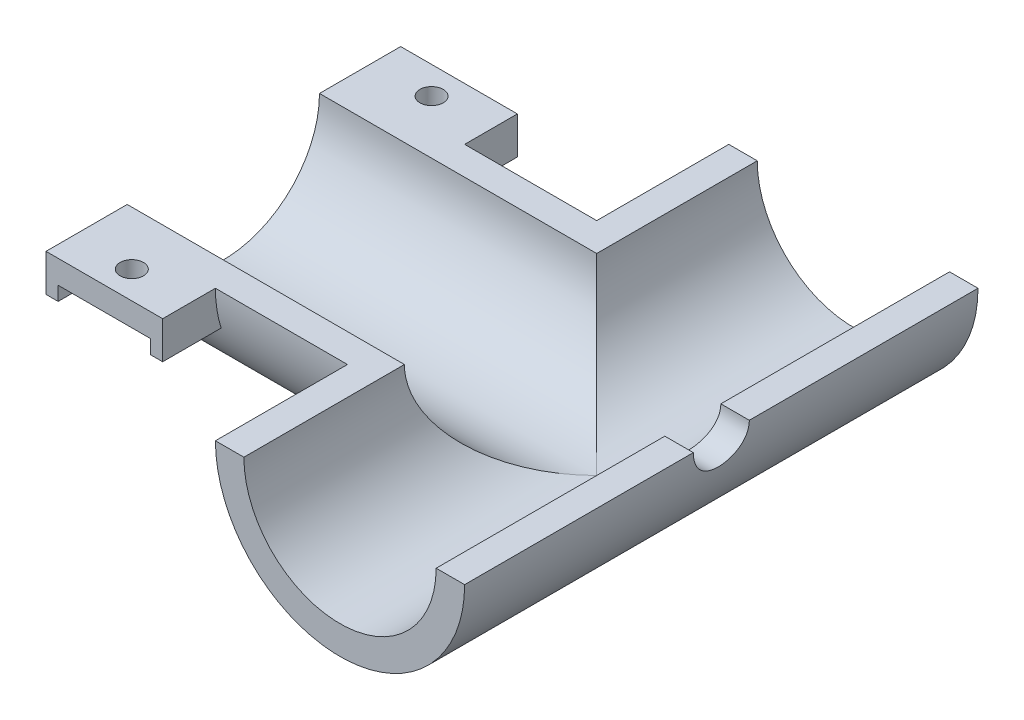
ISO-10303-21;
HEADER;
FILE_DESCRIPTION(('STEP AP214'),'2;1');
FILE_NAME('part.step','',(''),(''),'','','');
FILE_SCHEMA(('AUTOMOTIVE_DESIGN { 1 0 10303 214 1 1 1 1 }'));
ENDSEC;
DATA;
#1=APPLICATION_CONTEXT('core data for automotive mechanical design processes');
#2=APPLICATION_PROTOCOL_DEFINITION('international standard','automotive_design',2000,#1);
#3=PRODUCT_CONTEXT('',#1,'mechanical');
#4=PRODUCT('Part','Part','',(#3));
#5=PRODUCT_RELATED_PRODUCT_CATEGORY('part','',(#4));
#6=PRODUCT_DEFINITION_FORMATION('','',#4);
#7=PRODUCT_DEFINITION_CONTEXT('part definition',#1,'design');
#8=PRODUCT_DEFINITION('design','',#6,#7);
#9=PRODUCT_DEFINITION_SHAPE('','',#8);
#10=(LENGTH_UNIT() NAMED_UNIT(*) SI_UNIT(.MILLI.,.METRE.));
#11=(NAMED_UNIT(*) PLANE_ANGLE_UNIT() SI_UNIT($,.RADIAN.));
#12=(NAMED_UNIT(*) SI_UNIT($,.STERADIAN.) SOLID_ANGLE_UNIT());
#13=UNCERTAINTY_MEASURE_WITH_UNIT(LENGTH_MEASURE(1.E-05),#10,'distance_accuracy_value','');
#14=(GEOMETRIC_REPRESENTATION_CONTEXT(3) GLOBAL_UNCERTAINTY_ASSIGNED_CONTEXT((#13)) GLOBAL_UNIT_ASSIGNED_CONTEXT((#10,
#11,#12)) REPRESENTATION_CONTEXT('',''));
#15=CARTESIAN_POINT('',(0.,0.,0.));
#16=DIRECTION('',(0.,0.,1.));
#17=DIRECTION('',(1.,0.,0.));
#18=AXIS2_PLACEMENT_3D('',#15,#16,#17);
#19=CARTESIAN_POINT('',(1.651,-5.08,34.926));
#20=DIRECTION('',(-1.,0.,0.));
#21=DIRECTION('',(0.,0.,-1.));
#22=AXIS2_PLACEMENT_3D('',#19,#20,#21);
#23=PLANE('',#22);
#24=DIRECTION('',(0.,0.,-1.));
#25=VECTOR('',#24,1.);
#26=CARTESIAN_POINT('',(1.651,-3.175,34.926));
#27=LINE('',#26,#25);
#28=CARTESIAN_POINT('',(1.651,-3.175,-16.6545622953592));
#29=VERTEX_POINT('',#28);
#30=CARTESIAN_POINT('',(1.651,-3.175,-24.13));
#31=VERTEX_POINT('',#30);
#32=EDGE_CURVE('E140',#29,#31,#27,.T.);
#33=ORIENTED_EDGE('',*,*,#32,.F.);
#34=CARTESIAN_POINT('',(1.651,0.,0.));
#35=DIRECTION('',(-1.,0.,0.));
#36=DIRECTION('',(0.,0.,1.));
#37=AXIS2_PLACEMENT_3D('',#34,#35,#36);
#38=CIRCLE('',#37,16.9545);
#39=CARTESIAN_POINT('',(1.651,-5.08,-16.1755578033649));
#40=VERTEX_POINT('',#39);
#41=EDGE_CURVE('E121',#29,#40,#38,.T.);
#42=ORIENTED_EDGE('',*,*,#41,.T.);
#43=DIRECTION('',(0.,0.,-1.));
#44=VECTOR('',#43,1.);
#45=CARTESIAN_POINT('',(1.651,-5.08,34.926));
#46=LINE('',#45,#44);
#47=CARTESIAN_POINT('',(1.651,-5.08,-24.13));
#48=VERTEX_POINT('',#47);
#49=EDGE_CURVE('E143',#40,#48,#46,.T.);
#50=ORIENTED_EDGE('',*,*,#49,.T.);
#51=DIRECTION('',(0.,-1.,0.));
#52=VECTOR('',#51,1.);
#53=CARTESIAN_POINT('',(1.651,-5.08,-24.13));
#54=LINE('',#53,#52);
#55=EDGE_CURVE('E137',#31,#48,#54,.T.);
#56=ORIENTED_EDGE('',*,*,#55,.F.);
#57=EDGE_LOOP('',(#33,#42,#50,#56));
#58=FACE_BOUND('',#57,.T.);
#59=ADVANCED_FACE('F34',(#58),#23,.F.);
#60=CARTESIAN_POINT('',(0.,-5.08,34.926));
#61=DIRECTION('',(0.,-1.,0.));
#62=DIRECTION('',(0.,0.,1.));
#63=AXIS2_PLACEMENT_3D('',#60,#61,#62);
#64=PLANE('',#63);
#65=ORIENTED_EDGE('',*,*,#49,.F.);
#66=DIRECTION('',(-1.,0.,0.));
#67=VECTOR('',#66,1.);
#68=CARTESIAN_POINT('',(50.8,-5.08,-16.1755578033649));
#69=LINE('',#68,#67);
#70=CARTESIAN_POINT('',(0.,-5.08,-16.1755578033649));
#71=VERTEX_POINT('',#70);
#72=EDGE_CURVE('E12',#71,#40,#69,.F.);
#73=ORIENTED_EDGE('',*,*,#72,.F.);
#74=DIRECTION('',(0.,0.,-1.));
#75=VECTOR('',#74,1.);
#76=CARTESIAN_POINT('',(0.,-5.08,34.926));
#77=LINE('',#76,#75);
#78=CARTESIAN_POINT('',(0.,-5.08,-24.13));
#79=VERTEX_POINT('',#78);
#80=EDGE_CURVE('E113',#71,#79,#77,.T.);
#81=ORIENTED_EDGE('',*,*,#80,.T.);
#82=DIRECTION('',(1.,0.,0.));
#83=VECTOR('',#82,1.);
#84=CARTESIAN_POINT('',(0.,-5.08,-24.13));
#85=LINE('',#84,#83);
#86=EDGE_CURVE('E93',#79,#48,#85,.T.);
#87=ORIENTED_EDGE('',*,*,#86,.T.);
#88=EDGE_LOOP('',(#65,#73,#81,#87));
#89=FACE_BOUND('',#88,.T.);
#90=ADVANCED_FACE('F485',(#89),#64,.T.);
#91=CARTESIAN_POINT('',(0.,0.,34.926));
#92=DIRECTION('',(-1.,0.,0.));
#93=DIRECTION('',(0.,-1.,0.));
#94=AXIS2_PLACEMENT_3D('',#91,#92,#93);
#95=PLANE('',#94);
#96=DIRECTION('',(0.,0.,-1.));
#97=VECTOR('',#96,1.);
#98=CARTESIAN_POINT('',(0.,0.,34.926));
#99=LINE('',#98,#97);
#100=CARTESIAN_POINT('',(0.,0.,-13.081));
#101=VERTEX_POINT('',#100);
#102=CARTESIAN_POINT('',(0.,0.,-24.13));
#103=VERTEX_POINT('',#102);
#104=EDGE_CURVE('E110',#101,#103,#99,.T.);
#105=ORIENTED_EDGE('',*,*,#104,.T.);
#106=DIRECTION('',(0.,-1.,0.));
#107=VECTOR('',#106,1.);
#108=CARTESIAN_POINT('',(0.,0.,-24.13));
#109=LINE('',#108,#107);
#110=EDGE_CURVE('E99',#103,#79,#109,.T.);
#111=ORIENTED_EDGE('',*,*,#110,.T.);
#112=ORIENTED_EDGE('',*,*,#80,.F.);
#113=CARTESIAN_POINT('',(0.,0.,0.));
#114=DIRECTION('',(1.,0.,0.));
#115=DIRECTION('',(0.,0.,-1.));
#116=AXIS2_PLACEMENT_3D('',#113,#114,#115);
#117=CIRCLE('',#116,16.9545);
#118=CARTESIAN_POINT('',(0.,-5.08,16.1755578033649));
#119=VERTEX_POINT('',#118);
#120=EDGE_CURVE('E419',#119,#71,#117,.T.);
#121=ORIENTED_EDGE('',*,*,#120,.F.);
#122=DIRECTION('',(0.,0.,1.));
#123=VECTOR('',#122,1.);
#124=CARTESIAN_POINT('',(0.,-5.08,-34.926));
#125=LINE('',#124,#123);
#126=CARTESIAN_POINT('',(0.,-5.08,24.13));
#127=VERTEX_POINT('',#126);
#128=EDGE_CURVE('E343',#119,#127,#125,.T.);
#129=ORIENTED_EDGE('',*,*,#128,.T.);
#130=DIRECTION('',(0.,-1.,0.));
#131=VECTOR('',#130,1.);
#132=CARTESIAN_POINT('',(0.,0.,24.13));
#133=LINE('',#132,#131);
#134=CARTESIAN_POINT('',(0.,0.,24.13));
#135=VERTEX_POINT('',#134);
#136=EDGE_CURVE('E351',#135,#127,#133,.T.);
#137=ORIENTED_EDGE('',*,*,#136,.F.);
#138=DIRECTION('',(0.,0.,1.));
#139=VECTOR('',#138,1.);
#140=CARTESIAN_POINT('',(0.,0.,-34.926));
#141=LINE('',#140,#139);
#142=CARTESIAN_POINT('',(0.,0.,13.081));
#143=VERTEX_POINT('',#142);
#144=EDGE_CURVE('E346',#143,#135,#141,.T.);
#145=ORIENTED_EDGE('',*,*,#144,.F.);
#146=CARTESIAN_POINT('',(0.,0.,0.));
#147=DIRECTION('',(-1.,0.,0.));
#148=DIRECTION('',(0.,0.,1.));
#149=AXIS2_PLACEMENT_3D('',#146,#147,#148);
#150=CIRCLE('',#149,13.081);
#151=EDGE_CURVE('E725',#101,#143,#150,.T.);
#152=ORIENTED_EDGE('',*,*,#151,.F.);
#153=EDGE_LOOP('',(#105,#111,#112,#121,#129,#137,#145,#152));
#154=FACE_BOUND('',#153,.T.);
#155=ADVANCED_FACE('F415',(#154),#95,.T.);
#156=CARTESIAN_POINT('',(0.,0.,-24.13));
#157=DIRECTION('',(0.,0.,-1.));
#158=DIRECTION('',(1.,0.,0.));
#159=AXIS2_PLACEMENT_3D('',#156,#157,#158);
#160=PLANE('',#159);
#161=ORIENTED_EDGE('',*,*,#55,.T.);
#162=ORIENTED_EDGE('',*,*,#86,.F.);
#163=ORIENTED_EDGE('',*,*,#110,.F.);
#164=DIRECTION('',(-1.,0.,0.));
#165=VECTOR('',#164,1.);
#166=CARTESIAN_POINT('',(0.,0.,-24.13));
#167=LINE('',#166,#165);
#168=CARTESIAN_POINT('',(15.875,0.,-24.13));
#169=VERTEX_POINT('',#168);
#170=EDGE_CURVE('E92',#169,#103,#167,.T.);
#171=ORIENTED_EDGE('',*,*,#170,.F.);
#172=DIRECTION('',(0.,1.,0.));
#173=VECTOR('',#172,1.);
#174=CARTESIAN_POINT('',(15.875,0.,-24.13));
#175=LINE('',#174,#173);
#176=CARTESIAN_POINT('',(15.875,-5.08,-24.13));
#177=VERTEX_POINT('',#176);
#178=EDGE_CURVE('E81',#177,#169,#175,.T.);
#179=ORIENTED_EDGE('',*,*,#178,.F.);
#180=CARTESIAN_POINT('',(14.224,-5.08,-24.13));
#181=VERTEX_POINT('',#180);
#182=EDGE_CURVE('E150',#181,#177,#85,.T.);
#183=ORIENTED_EDGE('',*,*,#182,.F.);
#184=DIRECTION('',(0.,1.,0.));
#185=VECTOR('',#184,1.);
#186=CARTESIAN_POINT('',(14.224,-5.08,-24.13));
#187=LINE('',#186,#185);
#188=CARTESIAN_POINT('',(14.224,-3.175,-24.13));
#189=VERTEX_POINT('',#188);
#190=EDGE_CURVE('E134',#181,#189,#187,.T.);
#191=ORIENTED_EDGE('',*,*,#190,.T.);
#192=DIRECTION('',(-1.,0.,0.));
#193=VECTOR('',#192,1.);
#194=CARTESIAN_POINT('',(1.651,-3.175,-24.13));
#195=LINE('',#194,#193);
#196=EDGE_CURVE('E118',#189,#31,#195,.T.);
#197=ORIENTED_EDGE('',*,*,#196,.T.);
#198=EDGE_LOOP('',(#161,#162,#163,#171,#179,#183,#191,#197));
#199=FACE_BOUND('',#198,.T.);
#200=ADVANCED_FACE('F96',(#199),#160,.T.);
#201=CARTESIAN_POINT('',(15.875,0.,34.926));
#202=DIRECTION('',(1.,0.,0.));
#203=DIRECTION('',(0.,0.,1.));
#204=AXIS2_PLACEMENT_3D('',#201,#202,#203);
#205=PLANE('',#204);
#206=DIRECTION('',(0.,0.,-1.));
#207=VECTOR('',#206,1.);
#208=CARTESIAN_POINT('',(15.875,-5.08,34.926));
#209=LINE('',#208,#207);
#210=CARTESIAN_POINT('',(15.875,-5.08,-16.1755578033649));
#211=VERTEX_POINT('',#210);
#212=EDGE_CURVE('E89',#211,#177,#209,.T.);
#213=ORIENTED_EDGE('',*,*,#212,.T.);
#214=ORIENTED_EDGE('',*,*,#178,.T.);
#215=DIRECTION('',(0.,0.,-1.));
#216=VECTOR('',#215,1.);
#217=CARTESIAN_POINT('',(15.875,0.,34.926));
#218=LINE('',#217,#216);
#219=CARTESIAN_POINT('',(15.875,0.,-16.9545));
#220=VERTEX_POINT('',#219);
#221=EDGE_CURVE('E87',#220,#169,#218,.T.);
#222=ORIENTED_EDGE('',*,*,#221,.F.);
#223=CARTESIAN_POINT('',(15.875,0.,0.));
#224=DIRECTION('',(-1.,0.,0.));
#225=DIRECTION('',(0.,0.,1.));
#226=AXIS2_PLACEMENT_3D('',#223,#224,#225);
#227=CIRCLE('',#226,16.9545);
#228=EDGE_CURVE('E119',#211,#220,#227,.F.);
#229=ORIENTED_EDGE('',*,*,#228,.F.);
#230=EDGE_LOOP('',(#213,#214,#222,#229));
#231=FACE_BOUND('',#230,.T.);
#232=ADVANCED_FACE('F83',(#231),#205,.T.);
#233=CARTESIAN_POINT('',(0.,0.,34.926));
#234=DIRECTION('',(0.,1.,0.));
#235=DIRECTION('',(0.,0.,-1.));
#236=AXIS2_PLACEMENT_3D('',#233,#234,#235);
#237=PLANE('',#236);
#238=CARTESIAN_POINT('',(7.9375,0.,-20.3922811476796));
#239=DIRECTION('',(0.,1.,0.));
#240=DIRECTION('',(0.,0.,1.));
#241=AXIS2_PLACEMENT_3D('',#238,#239,#240);
#242=CIRCLE('',#241,1.5875);
#243=CARTESIAN_POINT('',(7.9375,0.,-18.8047811476796));
#244=VERTEX_POINT('',#243);
#245=EDGE_CURVE('E700',#244,#244,#242,.F.);
#246=ORIENTED_EDGE('',*,*,#245,.T.);
#247=EDGE_LOOP('',(#246));
#248=FACE_BOUND('',#247,.T.);
#249=ORIENTED_EDGE('',*,*,#221,.T.);
#250=ORIENTED_EDGE('',*,*,#170,.T.);
#251=ORIENTED_EDGE('',*,*,#104,.F.);
#252=DIRECTION('',(-1.,0.,0.));
#253=VECTOR('',#252,1.);
#254=CARTESIAN_POINT('',(50.8,0.,-13.081));
#255=LINE('',#254,#253);
#256=CARTESIAN_POINT('',(37.719,0.,-13.081));
#257=VERTEX_POINT('',#256);
#258=EDGE_CURVE('E280',#101,#257,#255,.F.);
#259=ORIENTED_EDGE('',*,*,#258,.T.);
#260=DIRECTION('',(0.,0.,-1.));
#261=VECTOR('',#260,1.);
#262=CARTESIAN_POINT('',(37.719,0.,34.925));
#263=LINE('',#262,#261);
#264=CARTESIAN_POINT('',(37.719,0.,-34.925));
#265=VERTEX_POINT('',#264);
#266=EDGE_CURVE('E281',#257,#265,#263,.T.);
#267=ORIENTED_EDGE('',*,*,#266,.T.);
#268=DIRECTION('',(-1.,0.,0.));
#269=VECTOR('',#268,1.);
#270=CARTESIAN_POINT('',(50.8,0.,-34.925));
#271=LINE('',#270,#269);
#272=CARTESIAN_POINT('',(33.8455,0.,-34.925));
#273=VERTEX_POINT('',#272);
#274=EDGE_CURVE('E295',#265,#273,#271,.T.);
#275=ORIENTED_EDGE('',*,*,#274,.T.);
#276=DIRECTION('',(0.,0.,-1.));
#277=VECTOR('',#276,1.);
#278=CARTESIAN_POINT('',(33.8455,0.,34.925));
#279=LINE('',#278,#277);
#280=CARTESIAN_POINT('',(33.8455,0.,-16.9545));
#281=VERTEX_POINT('',#280);
#282=EDGE_CURVE('E287',#273,#281,#279,.F.);
#283=ORIENTED_EDGE('',*,*,#282,.T.);
#284=DIRECTION('',(-1.,0.,0.));
#285=VECTOR('',#284,1.);
#286=CARTESIAN_POINT('',(50.8,0.,-16.9545));
#287=LINE('',#286,#285);
#288=EDGE_CURVE('E109',#281,#220,#287,.T.);
#289=ORIENTED_EDGE('',*,*,#288,.T.);
#290=EDGE_LOOP('',(#249,#250,#251,#259,#267,#275,#283,#289));
#291=FACE_BOUND('',#290,.T.);
#292=ADVANCED_FACE('F106',(#248,#291),#237,.T.);
#293=CARTESIAN_POINT('',(1.651,-3.175,34.926));
#294=DIRECTION('',(0.,1.,0.));
#295=DIRECTION('',(0.,0.,-1.));
#296=AXIS2_PLACEMENT_3D('',#293,#294,#295);
#297=PLANE('',#296);
#298=CARTESIAN_POINT('',(7.9375,-3.175,-20.3922811476796));
#299=DIRECTION('',(0.,1.,0.));
#300=DIRECTION('',(0.,0.,1.));
#301=AXIS2_PLACEMENT_3D('',#298,#299,#300);
#302=CIRCLE('',#301,1.5875);
#303=CARTESIAN_POINT('',(7.9375,-3.175,-18.8047811476796));
#304=VERTEX_POINT('',#303);
#305=EDGE_CURVE('E703',#304,#304,#302,.T.);
#306=ORIENTED_EDGE('',*,*,#305,.T.);
#307=EDGE_LOOP('',(#306));
#308=FACE_BOUND('',#307,.T.);
#309=DIRECTION('',(0.,0.,-1.));
#310=VECTOR('',#309,1.);
#311=CARTESIAN_POINT('',(14.224,-3.175,34.926));
#312=LINE('',#311,#310);
#313=CARTESIAN_POINT('',(14.224,-3.175,-16.6545622953592));
#314=VERTEX_POINT('',#313);
#315=EDGE_CURVE('E142',#314,#189,#312,.T.);
#316=ORIENTED_EDGE('',*,*,#315,.F.);
#317=DIRECTION('',(-1.,0.,0.));
#318=VECTOR('',#317,1.);
#319=CARTESIAN_POINT('',(50.8,-3.175,-16.6545622953592));
#320=LINE('',#319,#318);
#321=EDGE_CURVE('E53',#314,#29,#320,.T.);
#322=ORIENTED_EDGE('',*,*,#321,.T.);
#323=ORIENTED_EDGE('',*,*,#32,.T.);
#324=ORIENTED_EDGE('',*,*,#196,.F.);
#325=EDGE_LOOP('',(#316,#322,#323,#324));
#326=FACE_BOUND('',#325,.T.);
#327=ADVANCED_FACE('F164',(#308,#326),#297,.F.);
#328=DIRECTION('',(0.,0.,-1.));
#329=VECTOR('',#328,1.);
#330=CARTESIAN_POINT('',(14.224,-5.08,34.926));
#331=LINE('',#330,#329);
#332=CARTESIAN_POINT('',(14.224,-5.08,-16.1755578033649));
#333=VERTEX_POINT('',#332);
#334=EDGE_CURVE('E139',#333,#181,#331,.T.);
#335=ORIENTED_EDGE('',*,*,#334,.T.);
#336=ORIENTED_EDGE('',*,*,#182,.T.);
#337=ORIENTED_EDGE('',*,*,#212,.F.);
#338=EDGE_CURVE('E44',#333,#211,#69,.F.);
#339=ORIENTED_EDGE('',*,*,#338,.F.);
#340=EDGE_LOOP('',(#335,#336,#337,#339));
#341=FACE_BOUND('',#340,.T.);
#342=ADVANCED_FACE('F36',(#341),#64,.T.);
#343=CARTESIAN_POINT('',(14.224,-5.08,34.926));
#344=DIRECTION('',(1.,0.,0.));
#345=DIRECTION('',(0.,0.,1.));
#346=AXIS2_PLACEMENT_3D('',#343,#344,#345);
#347=PLANE('',#346);
#348=ORIENTED_EDGE('',*,*,#334,.F.);
#349=CARTESIAN_POINT('',(14.224,0.,0.));
#350=DIRECTION('',(1.,0.,0.));
#351=DIRECTION('',(0.,0.,-1.));
#352=AXIS2_PLACEMENT_3D('',#349,#350,#351);
#353=CIRCLE('',#352,16.9545);
#354=EDGE_CURVE('E103',#333,#314,#353,.T.);
#355=ORIENTED_EDGE('',*,*,#354,.T.);
#356=ORIENTED_EDGE('',*,*,#315,.T.);
#357=ORIENTED_EDGE('',*,*,#190,.F.);
#358=EDGE_LOOP('',(#348,#355,#356,#357));
#359=FACE_BOUND('',#358,.T.);
#360=ADVANCED_FACE('F160',(#359),#347,.F.);
#361=CARTESIAN_POINT('',(1.651,-5.08,-34.926));
#362=DIRECTION('',(-1.,0.,0.));
#363=DIRECTION('',(0.,0.,1.));
#364=AXIS2_PLACEMENT_3D('',#361,#362,#363);
#365=PLANE('',#364);
#366=DIRECTION('',(0.,0.,1.));
#367=VECTOR('',#366,1.);
#368=CARTESIAN_POINT('',(1.651,-3.175,-34.926));
#369=LINE('',#368,#367);
#370=CARTESIAN_POINT('',(1.651,-3.175,16.6545622953592));
#371=VERTEX_POINT('',#370);
#372=CARTESIAN_POINT('',(1.651,-3.175,24.13));
#373=VERTEX_POINT('',#372);
#374=EDGE_CURVE('E369',#371,#373,#369,.T.);
#375=ORIENTED_EDGE('',*,*,#374,.T.);
#376=DIRECTION('',(0.,-1.,0.));
#377=VECTOR('',#376,1.);
#378=CARTESIAN_POINT('',(1.651,-5.08,24.13));
#379=LINE('',#378,#377);
#380=CARTESIAN_POINT('',(1.651,-5.08,24.13));
#381=VERTEX_POINT('',#380);
#382=EDGE_CURVE('E373',#373,#381,#379,.T.);
#383=ORIENTED_EDGE('',*,*,#382,.T.);
#384=DIRECTION('',(0.,0.,1.));
#385=VECTOR('',#384,1.);
#386=CARTESIAN_POINT('',(1.651,-5.08,-34.926));
#387=LINE('',#386,#385);
#388=CARTESIAN_POINT('',(1.651,-5.08,16.1755578033649));
#389=VERTEX_POINT('',#388);
#390=EDGE_CURVE('E147',#389,#381,#387,.T.);
#391=ORIENTED_EDGE('',*,*,#390,.F.);
#392=CARTESIAN_POINT('',(1.651,0.,0.));
#393=DIRECTION('',(-1.,0.,0.));
#394=DIRECTION('',(0.,0.,1.));
#395=AXIS2_PLACEMENT_3D('',#392,#393,#394);
#396=CIRCLE('',#395,16.9545);
#397=EDGE_CURVE('E382',#389,#371,#396,.T.);
#398=ORIENTED_EDGE('',*,*,#397,.T.);
#399=EDGE_LOOP('',(#375,#383,#391,#398));
#400=FACE_BOUND('',#399,.T.);
#401=ADVANCED_FACE('F409',(#400),#365,.F.);
#402=CARTESIAN_POINT('',(1.651,-3.175,-34.926));
#403=DIRECTION('',(0.,1.,0.));
#404=DIRECTION('',(0.,0.,1.));
#405=AXIS2_PLACEMENT_3D('',#402,#403,#404);
#406=PLANE('',#405);
#407=CARTESIAN_POINT('',(7.9375,-3.175,20.3922811476796));
#408=DIRECTION('',(0.,-1.,0.));
#409=DIRECTION('',(0.,0.,-1.));
#410=AXIS2_PLACEMENT_3D('',#407,#408,#409);
#411=CIRCLE('',#410,1.5875);
#412=CARTESIAN_POINT('',(7.9375,-3.175,18.8047811476796));
#413=VERTEX_POINT('',#412);
#414=EDGE_CURVE('E698',#413,#413,#411,.T.);
#415=ORIENTED_EDGE('',*,*,#414,.F.);
#416=EDGE_LOOP('',(#415));
#417=FACE_BOUND('',#416,.T.);
#418=DIRECTION('',(0.,0.,1.));
#419=VECTOR('',#418,1.);
#420=CARTESIAN_POINT('',(14.224,-3.175,-34.926));
#421=LINE('',#420,#419);
#422=CARTESIAN_POINT('',(14.224,-3.175,16.6545622953592));
#423=VERTEX_POINT('',#422);
#424=CARTESIAN_POINT('',(14.224,-3.175,24.13));
#425=VERTEX_POINT('',#424);
#426=EDGE_CURVE('E372',#423,#425,#421,.T.);
#427=ORIENTED_EDGE('',*,*,#426,.T.);
#428=DIRECTION('',(-1.,0.,0.));
#429=VECTOR('',#428,1.);
#430=CARTESIAN_POINT('',(1.651,-3.175,24.13));
#431=LINE('',#430,#429);
#432=EDGE_CURVE('E345',#425,#373,#431,.T.);
#433=ORIENTED_EDGE('',*,*,#432,.T.);
#434=ORIENTED_EDGE('',*,*,#374,.F.);
#435=DIRECTION('',(-1.,0.,0.));
#436=VECTOR('',#435,1.);
#437=CARTESIAN_POINT('',(50.8,-3.175,16.6545622953592));
#438=LINE('',#437,#436);
#439=EDGE_CURVE('E385',#371,#423,#438,.F.);
#440=ORIENTED_EDGE('',*,*,#439,.T.);
#441=EDGE_LOOP('',(#427,#433,#434,#440));
#442=FACE_BOUND('',#441,.T.);
#443=ADVANCED_FACE('F405',(#417,#442),#406,.F.);
#444=CARTESIAN_POINT('',(0.,-5.08,-34.926));
#445=DIRECTION('',(0.,-1.,0.));
#446=DIRECTION('',(0.,0.,-1.));
#447=AXIS2_PLACEMENT_3D('',#444,#445,#446);
#448=PLANE('',#447);
#449=ORIENTED_EDGE('',*,*,#390,.T.);
#450=DIRECTION('',(1.,0.,0.));
#451=VECTOR('',#450,1.);
#452=CARTESIAN_POINT('',(0.,-5.08,24.13));
#453=LINE('',#452,#451);
#454=EDGE_CURVE('E357',#127,#381,#453,.T.);
#455=ORIENTED_EDGE('',*,*,#454,.F.);
#456=ORIENTED_EDGE('',*,*,#128,.F.);
#457=DIRECTION('',(-1.,0.,0.));
#458=VECTOR('',#457,1.);
#459=CARTESIAN_POINT('',(50.8,-5.08,16.1755578033649));
#460=LINE('',#459,#458);
#461=EDGE_CURVE('E338',#119,#389,#460,.F.);
#462=ORIENTED_EDGE('',*,*,#461,.T.);
#463=EDGE_LOOP('',(#449,#455,#456,#462));
#464=FACE_BOUND('',#463,.T.);
#465=ADVANCED_FACE('F412',(#464),#448,.T.);
#466=CARTESIAN_POINT('',(0.,0.,24.13));
#467=DIRECTION('',(0.,0.,1.));
#468=DIRECTION('',(1.,0.,0.));
#469=AXIS2_PLACEMENT_3D('',#466,#467,#468);
#470=PLANE('',#469);
#471=ORIENTED_EDGE('',*,*,#382,.F.);
#472=ORIENTED_EDGE('',*,*,#432,.F.);
#473=DIRECTION('',(0.,1.,0.));
#474=VECTOR('',#473,1.);
#475=CARTESIAN_POINT('',(14.224,-5.08,24.13));
#476=LINE('',#475,#474);
#477=CARTESIAN_POINT('',(14.224,-5.08,24.13));
#478=VERTEX_POINT('',#477);
#479=EDGE_CURVE('E377',#478,#425,#476,.T.);
#480=ORIENTED_EDGE('',*,*,#479,.F.);
#481=CARTESIAN_POINT('',(15.875,-5.08,24.13));
#482=VERTEX_POINT('',#481);
#483=EDGE_CURVE('E356',#478,#482,#453,.T.);
#484=ORIENTED_EDGE('',*,*,#483,.T.);
#485=DIRECTION('',(0.,1.,0.));
#486=VECTOR('',#485,1.);
#487=CARTESIAN_POINT('',(15.875,0.,24.13));
#488=LINE('',#487,#486);
#489=CARTESIAN_POINT('',(15.875,0.,24.13));
#490=VERTEX_POINT('',#489);
#491=EDGE_CURVE('E360',#482,#490,#488,.T.);
#492=ORIENTED_EDGE('',*,*,#491,.T.);
#493=DIRECTION('',(-1.,0.,0.));
#494=VECTOR('',#493,1.);
#495=CARTESIAN_POINT('',(0.,0.,24.13));
#496=LINE('',#495,#494);
#497=EDGE_CURVE('E363',#490,#135,#496,.T.);
#498=ORIENTED_EDGE('',*,*,#497,.T.);
#499=ORIENTED_EDGE('',*,*,#136,.T.);
#500=ORIENTED_EDGE('',*,*,#454,.T.);
#501=EDGE_LOOP('',(#471,#472,#480,#484,#492,#498,#499,#500));
#502=FACE_BOUND('',#501,.T.);
#503=ADVANCED_FACE('F400',(#502),#470,.T.);
#504=CARTESIAN_POINT('',(15.875,0.,-34.926));
#505=DIRECTION('',(1.,0.,0.));
#506=DIRECTION('',(0.,0.,-1.));
#507=AXIS2_PLACEMENT_3D('',#504,#505,#506);
#508=PLANE('',#507);
#509=DIRECTION('',(0.,0.,1.));
#510=VECTOR('',#509,1.);
#511=CARTESIAN_POINT('',(15.875,-5.08,-34.926));
#512=LINE('',#511,#510);
#513=CARTESIAN_POINT('',(15.875,-5.08,16.1755578033649));
#514=VERTEX_POINT('',#513);
#515=EDGE_CURVE('E347',#514,#482,#512,.T.);
#516=ORIENTED_EDGE('',*,*,#515,.F.);
#517=CARTESIAN_POINT('',(15.875,0.,0.));
#518=DIRECTION('',(1.,0.,0.));
#519=DIRECTION('',(0.,0.,-1.));
#520=AXIS2_PLACEMENT_3D('',#517,#518,#519);
#521=CIRCLE('',#520,16.9545);
#522=CARTESIAN_POINT('',(15.875,0.,16.9545));
#523=VERTEX_POINT('',#522);
#524=EDGE_CURVE('E328',#514,#523,#521,.F.);
#525=ORIENTED_EDGE('',*,*,#524,.T.);
#526=DIRECTION('',(0.,0.,1.));
#527=VECTOR('',#526,1.);
#528=CARTESIAN_POINT('',(15.875,0.,-34.926));
#529=LINE('',#528,#527);
#530=EDGE_CURVE('E350',#523,#490,#529,.T.);
#531=ORIENTED_EDGE('',*,*,#530,.T.);
#532=ORIENTED_EDGE('',*,*,#491,.F.);
#533=EDGE_LOOP('',(#516,#525,#531,#532));
#534=FACE_BOUND('',#533,.T.);
#535=ADVANCED_FACE('F621',(#534),#508,.T.);
#536=CARTESIAN_POINT('',(0.,0.,-34.926));
#537=DIRECTION('',(0.,1.,0.));
#538=DIRECTION('',(0.,0.,1.));
#539=AXIS2_PLACEMENT_3D('',#536,#537,#538);
#540=PLANE('',#539);
#541=CARTESIAN_POINT('',(7.9375,0.,20.3922811476796));
#542=DIRECTION('',(0.,1.,0.));
#543=DIRECTION('',(0.,0.,1.));
#544=AXIS2_PLACEMENT_3D('',#541,#542,#543);
#545=CIRCLE('',#544,1.5875);
#546=CARTESIAN_POINT('',(7.9375,0.,21.9797811476796));
#547=VERTEX_POINT('',#546);
#548=EDGE_CURVE('E38',#547,#547,#545,.T.);
#549=ORIENTED_EDGE('',*,*,#548,.F.);
#550=EDGE_LOOP('',(#549));
#551=FACE_BOUND('',#550,.T.);
#552=ORIENTED_EDGE('',*,*,#530,.F.);
#553=DIRECTION('',(-1.,0.,0.));
#554=VECTOR('',#553,1.);
#555=CARTESIAN_POINT('',(50.8,0.,16.9545));
#556=LINE('',#555,#554);
#557=CARTESIAN_POINT('',(33.8455,0.,16.9545));
#558=VERTEX_POINT('',#557);
#559=EDGE_CURVE('E309',#523,#558,#556,.F.);
#560=ORIENTED_EDGE('',*,*,#559,.T.);
#561=CARTESIAN_POINT('',(33.8455,0.,34.925));
#562=VERTEX_POINT('',#561);
#563=EDGE_CURVE('E297',#558,#562,#279,.F.);
#564=ORIENTED_EDGE('',*,*,#563,.T.);
#565=DIRECTION('',(-1.,0.,0.));
#566=VECTOR('',#565,1.);
#567=CARTESIAN_POINT('',(50.8,0.,34.925));
#568=LINE('',#567,#566);
#569=CARTESIAN_POINT('',(37.719,0.,34.925));
#570=VERTEX_POINT('',#569);
#571=EDGE_CURVE('E305',#570,#562,#568,.T.);
#572=ORIENTED_EDGE('',*,*,#571,.F.);
#573=CARTESIAN_POINT('',(37.719,0.,13.081));
#574=VERTEX_POINT('',#573);
#575=EDGE_CURVE('E299',#570,#574,#263,.T.);
#576=ORIENTED_EDGE('',*,*,#575,.T.);
#577=DIRECTION('',(-1.,0.,0.));
#578=VECTOR('',#577,1.);
#579=CARTESIAN_POINT('',(50.8,0.,13.081));
#580=LINE('',#579,#578);
#581=EDGE_CURVE('E711',#574,#143,#580,.T.);
#582=ORIENTED_EDGE('',*,*,#581,.T.);
#583=ORIENTED_EDGE('',*,*,#144,.T.);
#584=ORIENTED_EDGE('',*,*,#497,.F.);
#585=EDGE_LOOP('',(#552,#560,#564,#572,#576,#582,#583,#584));
#586=FACE_BOUND('',#585,.T.);
#587=ADVANCED_FACE('F619',(#551,#586),#540,.T.);
#588=DIRECTION('',(0.,0.,1.));
#589=VECTOR('',#588,1.);
#590=CARTESIAN_POINT('',(14.224,-5.08,-34.926));
#591=LINE('',#590,#589);
#592=CARTESIAN_POINT('',(14.224,-5.08,16.1755578033649));
#593=VERTEX_POINT('',#592);
#594=EDGE_CURVE('E370',#593,#478,#591,.T.);
#595=ORIENTED_EDGE('',*,*,#594,.F.);
#596=EDGE_CURVE('E332',#593,#514,#460,.F.);
#597=ORIENTED_EDGE('',*,*,#596,.T.);
#598=ORIENTED_EDGE('',*,*,#515,.T.);
#599=ORIENTED_EDGE('',*,*,#483,.F.);
#600=EDGE_LOOP('',(#595,#597,#598,#599));
#601=FACE_BOUND('',#600,.T.);
#602=ADVANCED_FACE('F396',(#601),#448,.T.);
#603=CARTESIAN_POINT('',(14.224,-5.08,-34.926));
#604=DIRECTION('',(1.,0.,0.));
#605=DIRECTION('',(0.,0.,-1.));
#606=AXIS2_PLACEMENT_3D('',#603,#604,#605);
#607=PLANE('',#606);
#608=ORIENTED_EDGE('',*,*,#594,.T.);
#609=ORIENTED_EDGE('',*,*,#479,.T.);
#610=ORIENTED_EDGE('',*,*,#426,.F.);
#611=CARTESIAN_POINT('',(14.224,0.,0.));
#612=DIRECTION('',(1.,0.,0.));
#613=DIRECTION('',(0.,0.,-1.));
#614=AXIS2_PLACEMENT_3D('',#611,#612,#613);
#615=CIRCLE('',#614,16.9545);
#616=EDGE_CURVE('E365',#423,#593,#615,.T.);
#617=ORIENTED_EDGE('',*,*,#616,.T.);
#618=EDGE_LOOP('',(#608,#609,#610,#617));
#619=FACE_BOUND('',#618,.T.);
#620=ADVANCED_FACE('F392',(#619),#607,.F.);
#621=CARTESIAN_POINT('',(50.8,0.,0.));
#622=DIRECTION('',(-1.,0.,0.));
#623=DIRECTION('',(0.,0.,1.));
#624=AXIS2_PLACEMENT_3D('',#621,#622,#623);
#625=CYLINDRICAL_SURFACE('',#624,16.9545);
#626=ORIENTED_EDGE('',*,*,#72,.T.);
#627=ORIENTED_EDGE('',*,*,#41,.F.);
#628=ORIENTED_EDGE('',*,*,#321,.F.);
#629=ORIENTED_EDGE('',*,*,#354,.F.);
#630=ORIENTED_EDGE('',*,*,#338,.T.);
#631=ORIENTED_EDGE('',*,*,#228,.T.);
#632=ORIENTED_EDGE('',*,*,#288,.F.);
#633=CARTESIAN_POINT('',(50.8,0.,0.));
#634=DIRECTION('',(-0.707106781186547,0.,0.707106781186547));
#635=DIRECTION('',(-0.707106781186547,0.,-0.707106781186547));
#636=AXIS2_PLACEMENT_3D('',#633,#634,#635);
#637=ELLIPSE('',#636,23.9772838432546,16.9545);
#638=CARTESIAN_POINT('',(50.8,-16.9545,0.));
#639=VERTEX_POINT('',#638);
#640=EDGE_CURVE('E279',#639,#281,#637,.F.);
#641=ORIENTED_EDGE('',*,*,#640,.F.);
#642=CARTESIAN_POINT('',(50.8,0.,0.));
#643=DIRECTION('',(-0.707106781186547,0.,-0.707106781186547));
#644=DIRECTION('',(-0.707106781186547,0.,0.707106781186547));
#645=AXIS2_PLACEMENT_3D('',#642,#643,#644);
#646=ELLIPSE('',#645,23.9772838432546,16.9545);
#647=EDGE_CURVE('E290',#558,#639,#646,.F.);
#648=ORIENTED_EDGE('',*,*,#647,.F.);
#649=ORIENTED_EDGE('',*,*,#559,.F.);
#650=ORIENTED_EDGE('',*,*,#524,.F.);
#651=ORIENTED_EDGE('',*,*,#596,.F.);
#652=ORIENTED_EDGE('',*,*,#616,.F.);
#653=ORIENTED_EDGE('',*,*,#439,.F.);
#654=ORIENTED_EDGE('',*,*,#397,.F.);
#655=ORIENTED_EDGE('',*,*,#461,.F.);
#656=ORIENTED_EDGE('',*,*,#120,.T.);
#657=EDGE_LOOP('',(#626,#627,#628,#629,#630,#631,#632,#641,#648,#649,#650,#651,#652,#653,#654,
#655,#656));
#658=FACE_BOUND('',#657,.T.);
#659=ADVANCED_FACE('F277',(#658),#625,.T.);
#660=CARTESIAN_POINT('',(67.7545,0.,0.));
#661=DIRECTION('',(-1.,0.,0.));
#662=DIRECTION('',(0.,0.,1.));
#663=AXIS2_PLACEMENT_3D('',#660,#661,#662);
#664=CYLINDRICAL_SURFACE('',#663,3.81);
#665=CARTESIAN_POINT('',(67.7545,0.,3.81));
#666=CARTESIAN_POINT('',(67.7544961322528,-0.211165613715782,3.80999299743646));
#667=CARTESIAN_POINT('',(67.7505149997327,-0.422414602967555,3.79238528087151));
#668=CARTESIAN_POINT('',(67.7350182100405,-0.838902256614382,3.72249860712259));
#669=CARTESIAN_POINT('',(67.7234973720573,-1.04413668679757,3.67019580932636));
#670=CARTESIAN_POINT('',(67.6942026607717,-1.44251678596381,3.53264769634259));
#671=CARTESIAN_POINT('',(67.6764355016048,-1.63567517387164,3.4474377432245));
#672=CARTESIAN_POINT('',(67.6365610709494,-2.00494882474157,3.24660863399541));
#673=CARTESIAN_POINT('',(67.6144538634945,-2.18106433909931,3.13098992653076));
#674=CARTESIAN_POINT('',(67.5678999079981,-2.5142315741131,2.87056039783955));
#675=CARTESIAN_POINT('',(67.5434228145635,-2.67095441440685,2.72533423077463));
#676=CARTESIAN_POINT('',(67.4950993440395,-2.95803456013999,2.41070345653643));
#677=CARTESIAN_POINT('',(67.4712530258948,-3.08838940906087,2.24129659912528));
#678=CARTESIAN_POINT('',(67.4265907415364,-3.32050164067653,1.88065943179212));
#679=CARTESIAN_POINT('',(67.4058135982894,-3.42190567574779,1.68919646256613));
#680=CARTESIAN_POINT('',(67.3700790455536,-3.59097022109943,1.29140274888612));
#681=CARTESIAN_POINT('',(67.3551208985493,-3.65863500789116,1.08507389250674));
#682=CARTESIAN_POINT('',(67.3330275634374,-3.75720696820301,0.66698215885847));
#683=CARTESIAN_POINT('',(67.3257682370252,-3.7886981311885,0.455363669038546));
#684=CARTESIAN_POINT('',(67.3195218816851,-3.81584537689869,0.0297322355989159));
#685=CARTESIAN_POINT('',(67.3205337772764,-3.81150611853848,-0.18428039310481));
#686=CARTESIAN_POINT('',(67.330603287131,-3.76758492185679,-0.604259675723122));
#687=CARTESIAN_POINT('',(67.3395053071518,-3.72868449868483,-0.810301901102371));
#688=CARTESIAN_POINT('',(67.3641056789527,-3.61782628960165,-1.21285880396746));
#689=CARTESIAN_POINT('',(67.3798044309604,-3.54586655696793,-1.40937291962987));
#690=CARTESIAN_POINT('',(67.4163808093588,-3.37031492879058,-1.78919500703967));
#691=CARTESIAN_POINT('',(67.437300623464,-3.26646368256313,-1.9723788763375));
#692=CARTESIAN_POINT('',(67.4819365013306,-3.03025914990661,-2.31897074526637));
#693=CARTESIAN_POINT('',(67.5056529660037,-2.89790177475023,-2.48237590271476));
#694=CARTESIAN_POINT('',(67.5538752521482,-2.60484857508086,-2.78869241565451));
#695=CARTESIAN_POINT('',(67.5783867232641,-2.44357400182968,-2.93104976634181));
#696=CARTESIAN_POINT('',(67.6249442742457,-2.09915941326128,-3.18679079380948));
#697=CARTESIAN_POINT('',(67.6469903045011,-1.91601895810559,-3.30017388762027));
#698=CARTESIAN_POINT('',(67.6862109110939,-1.53237439676449,-3.49489664025369));
#699=CARTESIAN_POINT('',(67.7033739460918,-1.33183059136234,-3.5761605563253));
#700=CARTESIAN_POINT('',(67.7308094115094,-0.919461826041211,-3.70368026999148));
#701=CARTESIAN_POINT('',(67.7410829008867,-0.707638605229872,-3.74994144782236));
#702=CARTESIAN_POINT('',(67.7534299084749,-0.283473121548594,-3.80532941304234));
#703=CARTESIAN_POINT('',(67.7556704135795,-0.0712343478580115,-3.81521253246657));
#704=CARTESIAN_POINT('',(67.7521683439758,0.351861845900899,-3.79961827380931));
#705=CARTESIAN_POINT('',(67.7464263424628,0.562719364059967,-3.77414343465725));
#706=CARTESIAN_POINT('',(67.7277101278995,0.974539350188288,-3.68918299886257));
#707=CARTESIAN_POINT('',(67.7148209322548,1.17558846576325,-3.6300970043553));
#708=CARTESIAN_POINT('',(67.6832543357969,1.56492046298818,-3.48003736943277));
#709=CARTESIAN_POINT('',(67.6645764234453,1.7532022146163,-3.38906091082132));
#710=CARTESIAN_POINT('',(67.623094171896,2.11476097430584,-3.17624719270358));
#711=CARTESIAN_POINT('',(67.6002323765637,2.28777192337358,-3.05396936605807));
#712=CARTESIAN_POINT('',(67.5530302577126,2.61108994631956,-2.78260089265317));
#713=CARTESIAN_POINT('',(67.5286897310501,2.76139389084233,-2.63350655637969));
#714=CARTESIAN_POINT('',(67.4806921516995,3.03804507527961,-2.30925828904077));
#715=CARTESIAN_POINT('',(67.457057725781,3.16386721139671,-2.13365234943376));
#716=CARTESIAN_POINT('',(67.4136889241309,3.38423926203304,-1.76335953319047));
#717=CARTESIAN_POINT('',(67.3939543769438,3.47879055147601,-1.56867349596033));
#718=CARTESIAN_POINT('',(67.3608146092711,3.63328187414742,-1.16680223539604));
#719=CARTESIAN_POINT('',(67.3473732251263,3.69342011712368,-0.959696340755954));
#720=CARTESIAN_POINT('',(67.328281001332,3.77795047198667,-0.537975694744862));
#721=CARTESIAN_POINT('',(67.3226288356814,3.80234866814065,-0.32336222780881));
#722=CARTESIAN_POINT('',(67.3198418328621,3.81443632118376,0.101978733275283));
#723=CARTESIAN_POINT('',(67.3225135600197,3.80295944412309,0.312681691244368));
#724=CARTESIAN_POINT('',(67.3356340587089,3.74549451339473,0.729068207389434));
#725=CARTESIAN_POINT('',(67.3460827278357,3.69950691415607,0.934751831621993));
#726=CARTESIAN_POINT('',(67.3734829642582,3.57473873294787,1.33455441623917));
#727=CARTESIAN_POINT('',(67.3904091817464,3.49608588503474,1.52871509241979));
#728=CARTESIAN_POINT('',(67.4288659794801,3.30832730060916,1.90120636466733));
#729=CARTESIAN_POINT('',(67.450397069723,3.19921819060556,2.07953520423342));
#730=CARTESIAN_POINT('',(67.4962106676172,2.9509068984053,2.41939589189918));
#731=CARTESIAN_POINT('',(67.5205420025107,2.81111336738327,2.58048918451275));
#732=CARTESIAN_POINT('',(67.5688935488287,2.50659172326478,2.87720378700155));
#733=CARTESIAN_POINT('',(67.592913686778,2.34185783402608,3.01281917989414));
#734=CARTESIAN_POINT('',(67.6383318669811,1.98937853861111,3.2565348738356));
#735=CARTESIAN_POINT('',(67.6596889491185,1.80134581786578,3.36422772969919));
#736=CARTESIAN_POINT('',(67.6969604300529,1.40940237288064,3.54630742749835));
#737=CARTESIAN_POINT('',(67.7128792727535,1.20550478085994,3.62072147893565));
#738=CARTESIAN_POINT('',(67.7347273361849,0.83458173433239,3.72126532010856));
#739=CARTESIAN_POINT('',(67.7420952739312,0.669523601887519,3.7544758635091));
#740=CARTESIAN_POINT('',(67.751983027039,0.336327842666919,3.79884545044265));
#741=CARTESIAN_POINT('',(67.7545030806049,0.168190367606953,3.81000557744092));
#742=CARTESIAN_POINT('',(67.7545,0.,3.81));
#743=B_SPLINE_CURVE_WITH_KNOTS('',3,(#665,#666,#667,#668,#669,#670,#671,#672,#673,#674,#675,
#676,#677,#678,#679,#680,#681,#682,#683,#684,#685,#686,#687,#688,#689,#690,#691,#692,#693,#694,
#695,#696,#697,#698,#699,#700,#701,#702,#703,#704,#705,#706,#707,#708,#709,#710,#711,#712,#713,
#714,#715,#716,#717,#718,#719,#720,#721,#722,#723,#724,#725,#726,#727,#728,#729,#730,#731,#732,
#733,#734,#735,#736,#737,#738,#739,#740,#741,#742),.UNSPECIFIED.,.T.,.F.,(4,2,2,2,2,2,2,2,2,2,2,
2,2,2,2,2,2,2,2,2,2,2,2,2,2,2,2,2,2,2,2,2,2,2,2,2,2,2,4),(0.,0.63288107157,1.26619747641796,
1.89883520394241,2.53146359814549,3.17366701438524,3.8159302326291,4.46572645671093,
5.11544029698394,5.75451079902998,6.39349820609135,7.02015829738256,7.64685529475888,
8.27879014113902,8.91081568843705,9.55729214872093,10.2037816152553,10.8517866510569,
11.4996920623988,12.1340483245023,12.7683590380922,13.3952815111022,14.0222593999291,
14.6586001734248,15.29502856409,15.943884273699,16.5927114504779,17.2377629387633,
17.882704602852,18.5127714364043,19.142829973531,19.7704475904217,20.3981347530499,
21.0391883985515,21.6803907386872,22.3304808475067,22.9800384518293,23.484143873306,
23.9882245245341),.UNSPECIFIED.);
#744=CARTESIAN_POINT('',(67.7545,0.,3.81));
#745=VERTEX_POINT('',#744);
#746=CARTESIAN_POINT('',(67.7545,0.,-3.81));
#747=VERTEX_POINT('',#746);
#748=EDGE_CURVE('E438',#745,#747,#743,.T.);
#749=ORIENTED_EDGE('',*,*,#748,.T.);
#750=DIRECTION('',(-1.,0.,0.));
#751=VECTOR('',#750,1.);
#752=CARTESIAN_POINT('',(67.7545,0.,-3.81));
#753=LINE('',#752,#751);
#754=CARTESIAN_POINT('',(63.881,0.,-3.81));
#755=VERTEX_POINT('',#754);
#756=EDGE_CURVE('E424',#747,#755,#753,.T.);
#757=ORIENTED_EDGE('',*,*,#756,.T.);
#758=CARTESIAN_POINT('',(63.881,0.,3.81));
#759=CARTESIAN_POINT('',(63.8809977587305,0.209291245875358,3.80999673490119));
#760=CARTESIAN_POINT('',(63.8759287136561,0.418615764576318,3.79269741858401));
#761=CARTESIAN_POINT('',(63.8562016550924,0.831186793770183,3.72410998787722));
#762=CARTESIAN_POINT('',(63.8415403087222,1.03443116601663,3.67281005976677));
#763=CARTESIAN_POINT('',(63.8042383549984,1.4288304505991,3.53806660513552));
#764=CARTESIAN_POINT('',(63.7816091259524,1.62000214625819,3.45466889920703));
#765=CARTESIAN_POINT('',(63.7307340917313,1.98564800076413,3.25828030527933));
#766=CARTESIAN_POINT('',(63.7024876368995,2.16012022478323,3.14528599382303));
#767=CARTESIAN_POINT('',(63.642541310177,2.49216380805861,2.88966876468334));
#768=CARTESIAN_POINT('',(63.6107737709877,2.64921620293411,2.74638761362443));
#769=CARTESIAN_POINT('',(63.5477775069311,2.93743758912017,2.43566790622334));
#770=CARTESIAN_POINT('',(63.5165488672507,3.06860252184433,2.26822556904916));
#771=CARTESIAN_POINT('',(63.4574569887632,3.30400127225362,1.9096135950628));
#772=CARTESIAN_POINT('',(63.4296782027905,3.407611640171,1.71801949995129));
#773=CARTESIAN_POINT('',(63.3816381898301,3.58093397401025,1.31918813383195));
#774=CARTESIAN_POINT('',(63.3613752743618,3.65065355477385,1.11195438896074));
#775=CARTESIAN_POINT('',(63.3313646342981,3.7523626148079,0.693533166551896));
#776=CARTESIAN_POINT('',(63.3213520175453,3.78530467274286,0.482596735795413));
#777=CARTESIAN_POINT('',(63.3121866540907,3.81549696693162,0.0579718945052486));
#778=CARTESIAN_POINT('',(63.3130314447585,3.81275529681317,-0.15571588099593));
#779=CARTESIAN_POINT('',(63.3252500395909,3.77240834139468,-0.572118468227484));
#780=CARTESIAN_POINT('',(63.3362668629962,3.73598502538006,-0.774959996361737));
#781=CARTESIAN_POINT('',(63.3670123040367,3.63121384210272,-1.17151909398718));
#782=CARTESIAN_POINT('',(63.3867417368732,3.56286298748393,-1.36523580783161));
#783=CARTESIAN_POINT('',(63.4329820590146,3.39528158177455,-1.74098883483331));
#784=CARTESIAN_POINT('',(63.4595781637329,3.2956593316925,-1.92283952162442));
#785=CARTESIAN_POINT('',(63.5165128502913,3.06863551069689,-2.26764388349157));
#786=CARTESIAN_POINT('',(63.5468522931429,2.94122754355114,-2.43059319424536));
#787=CARTESIAN_POINT('',(63.6093134253761,2.65633136061544,-2.73968715958262));
#788=CARTESIAN_POINT('',(63.6414583336147,2.4978589589607,-2.88492146893996));
#789=CARTESIAN_POINT('',(63.7028500870654,2.15840863861001,-3.14695817673436));
#790=CARTESIAN_POINT('',(63.7320967700849,1.97742946165131,-3.26375898448883));
#791=CARTESIAN_POINT('',(63.7846384010277,1.59651552864854,-3.46612353138461));
#792=CARTESIAN_POINT('',(63.8078965612646,1.39647348942061,-3.55149551695418));
#793=CARTESIAN_POINT('',(63.845575528853,0.984038240298636,-3.68712064361743));
#794=CARTESIAN_POINT('',(63.8599986542411,0.771648286136884,-3.7373829968658));
#795=CARTESIAN_POINT('',(63.8780201662911,0.348293311703331,-3.79987015290403));
#796=CARTESIAN_POINT('',(63.8819698126112,0.137525223245402,-3.81332974816479));
#797=CARTESIAN_POINT('',(63.8796242403675,-0.283266813571956,-3.80527638365008));
#798=CARTESIAN_POINT('',(63.8733303037002,-0.493290851746772,-3.78376779984241));
#799=CARTESIAN_POINT('',(63.8514339744927,-0.902041536268201,-3.70739141306535));
#800=CARTESIAN_POINT('',(63.8360305496489,-1.1009129908962,-3.65323619627656));
#801=CARTESIAN_POINT('',(63.7976869084124,-1.48671127232873,-3.51395297911378));
#802=CARTESIAN_POINT('',(63.7747458063851,-1.67363669245728,-3.4288213390583));
#803=CARTESIAN_POINT('',(63.7230801262253,-2.03484998305381,-3.22787058918503));
#804=CARTESIAN_POINT('',(63.6942383070545,-2.20876449790557,-3.11141130321114));
#805=CARTESIAN_POINT('',(63.6340900225582,-2.53500672232951,-2.85189605256177));
#806=CARTESIAN_POINT('',(63.6027829755333,-2.68732931314957,-2.7088337996982));
#807=CARTESIAN_POINT('',(63.5398991292182,-2.9714391972875,-2.39437975495138));
#808=CARTESIAN_POINT('',(63.5083495114024,-3.10234951465469,-2.22218852023954));
#809=CARTESIAN_POINT('',(63.4496967940128,-3.33346679582496,-1.85759927060913));
#810=CARTESIAN_POINT('',(63.4225935528615,-3.43367473731461,-1.66520189939688));
#811=CARTESIAN_POINT('',(63.37621794816,-3.59982671170791,-1.26639472436297));
#812=CARTESIAN_POINT('',(63.356905910317,-3.66594482813674,-1.06006232324725));
#813=CARTESIAN_POINT('',(63.3283699806672,-3.76232397701495,-0.638531971680397));
#814=CARTESIAN_POINT('',(63.3191428810291,-3.79259641156444,-0.423336862904982));
#815=CARTESIAN_POINT('',(63.3121248561498,-3.81568071078072,0.000737345358188882));
#816=CARTESIAN_POINT('',(63.3138992487331,-3.80991635550188,0.209532799783925));
#817=CARTESIAN_POINT('',(63.3276466054196,-3.76446317256841,0.62303837731684));
#818=CARTESIAN_POINT('',(63.3396192038243,-3.72477556137086,0.827748646645674));
#819=CARTESIAN_POINT('',(63.3721309518042,-3.61349736309602,1.22509214312757));
#820=CARTESIAN_POINT('',(63.3925742275056,-3.54226322782318,1.41783361334309));
#821=CARTESIAN_POINT('',(63.4397112595481,-3.37019025268743,1.78878249817654));
#822=CARTESIAN_POINT('',(63.4664061574126,-3.26934600527152,1.96698725042052));
#823=CARTESIAN_POINT('',(63.5241903692262,-3.03683079337797,2.31046336266756));
#824=CARTESIAN_POINT('',(63.5553996713044,-2.90421489288897,2.47507488490123));
#825=CARTESIAN_POINT('',(63.6180912100828,-2.61364774774894,2.78016934209915));
#826=CARTESIAN_POINT('',(63.6495735142889,-2.45569005740794,2.9206461195103));
#827=CARTESIAN_POINT('',(63.7102825479619,-2.11378241846617,3.17725132101353));
#828=CARTESIAN_POINT('',(63.7394254079851,-1.92924574915342,3.29261978405132));
#829=CARTESIAN_POINT('',(63.7911917070765,-1.54254631882407,3.49052549565177));
#830=CARTESIAN_POINT('',(63.8138185127835,-1.3403927304957,3.57307970671333));
#831=CARTESIAN_POINT('',(63.8477641080798,-0.949759462934581,3.69467837443187));
#832=CARTESIAN_POINT('',(63.8601279963032,-0.762634632040363,3.73781156447433));
#833=CARTESIAN_POINT('',(63.8767463777866,-0.383682060364853,3.79547178637431));
#834=CARTESIAN_POINT('',(63.8810020545474,-0.191855010075544,3.81000299308058));
#835=CARTESIAN_POINT('',(63.881,0.,3.81));
#836=B_SPLINE_CURVE_WITH_KNOTS('',3,(#758,#759,#760,#761,#762,#763,#764,#765,#766,#767,#768,
#769,#770,#771,#772,#773,#774,#775,#776,#777,#778,#779,#780,#781,#782,#783,#784,#785,#786,#787,
#788,#789,#790,#791,#792,#793,#794,#795,#796,#797,#798,#799,#800,#801,#802,#803,#804,#805,#806,
#807,#808,#809,#810,#811,#812,#813,#814,#815,#816,#817,#818,#819,#820,#821,#822,#823,#824,#825,
#826,#827,#828,#829,#830,#831,#832,#833,#834,#835),.UNSPECIFIED.,.T.,.F.,(4,2,2,2,2,2,2,2,2,2,2,
2,2,2,2,2,2,2,2,2,2,2,2,2,2,2,2,2,2,2,2,2,2,2,2,2,2,2,4),(0.,0.627169327029117,1.25455668220218,
1.88105172424087,2.5076192653629,3.14954180385242,3.79156490191616,4.44707152637114,
5.10243079841853,5.74039047483699,6.37820545454297,6.99445415535564,7.61076052811107,
8.23511730939763,8.85961796871506,9.50862455766586,10.1576674462737,10.8106071043579,
11.4633753780559,12.0939567135661,12.7244591433027,13.3416739647363,13.9589613313811,
14.5899724521415,15.2211329160949,15.8738077887592,16.5264618754821,17.1757492520239,
17.8248300421728,18.4484327598623,19.0720131166638,19.6887204511444,20.3055404820579,
20.9436781336797,21.581978353836,22.2375156369867,22.8927136146284,23.4677168550924,
24.0426361597819),.UNSPECIFIED.);
#837=CARTESIAN_POINT('',(63.881,0.,3.81));
#838=VERTEX_POINT('',#837);
#839=EDGE_CURVE('E300',#755,#838,#836,.T.);
#840=ORIENTED_EDGE('',*,*,#839,.T.);
#841=DIRECTION('',(-1.,0.,0.));
#842=VECTOR('',#841,1.);
#843=CARTESIAN_POINT('',(67.7545,0.,3.81));
#844=LINE('',#843,#842);
#845=EDGE_CURVE('E421',#838,#745,#844,.F.);
#846=ORIENTED_EDGE('',*,*,#845,.T.);
#847=EDGE_LOOP('',(#749,#757,#840,#846));
#848=FACE_BOUND('',#847,.T.);
#849=ADVANCED_FACE('F442',(#848),#664,.F.);
#850=CARTESIAN_POINT('',(0.,0.,0.));
#851=DIRECTION('',(0.,1.,0.));
#852=DIRECTION('',(0.,0.,1.));
#853=AXIS2_PLACEMENT_3D('',#850,#851,#852);
#854=PLANE('',#853);
#855=CARTESIAN_POINT('',(67.7545,0.,34.925));
#856=VERTEX_POINT('',#855);
#857=CARTESIAN_POINT('',(63.881,0.,34.925));
#858=VERTEX_POINT('',#857);
#859=EDGE_CURVE('E311',#856,#858,#568,.T.);
#860=ORIENTED_EDGE('',*,*,#859,.F.);
#861=DIRECTION('',(0.,0.,-1.));
#862=VECTOR('',#861,1.);
#863=CARTESIAN_POINT('',(67.7545,0.,34.925));
#864=LINE('',#863,#862);
#865=EDGE_CURVE('E319',#856,#745,#864,.T.);
#866=ORIENTED_EDGE('',*,*,#865,.T.);
#867=ORIENTED_EDGE('',*,*,#845,.F.);
#868=DIRECTION('',(0.,0.,-1.));
#869=VECTOR('',#868,1.);
#870=CARTESIAN_POINT('',(63.881,0.,34.925));
#871=LINE('',#870,#869);
#872=EDGE_CURVE('E322',#838,#858,#871,.F.);
#873=ORIENTED_EDGE('',*,*,#872,.T.);
#874=EDGE_LOOP('',(#860,#866,#867,#873));
#875=FACE_BOUND('',#874,.T.);
#876=ADVANCED_FACE('F446',(#875),#854,.T.);
#877=CARTESIAN_POINT('',(67.7545,0.,-34.925));
#878=VERTEX_POINT('',#877);
#879=EDGE_CURVE('E323',#747,#878,#864,.T.);
#880=ORIENTED_EDGE('',*,*,#879,.T.);
#881=CARTESIAN_POINT('',(63.881,0.,-34.925));
#882=VERTEX_POINT('',#881);
#883=EDGE_CURVE('E302',#878,#882,#271,.T.);
#884=ORIENTED_EDGE('',*,*,#883,.T.);
#885=EDGE_CURVE('E320',#882,#755,#871,.F.);
#886=ORIENTED_EDGE('',*,*,#885,.T.);
#887=ORIENTED_EDGE('',*,*,#756,.F.);
#888=EDGE_LOOP('',(#880,#884,#886,#887));
#889=FACE_BOUND('',#888,.T.);
#890=ADVANCED_FACE('F472',(#889),#854,.T.);
#891=CARTESIAN_POINT('',(50.8,0.,0.));
#892=DIRECTION('',(-1.,0.,0.));
#893=DIRECTION('',(0.,0.,1.));
#894=AXIS2_PLACEMENT_3D('',#891,#892,#893);
#895=CYLINDRICAL_SURFACE('',#894,13.081);
#896=ORIENTED_EDGE('',*,*,#258,.F.);
#897=ORIENTED_EDGE('',*,*,#151,.T.);
#898=ORIENTED_EDGE('',*,*,#581,.F.);
#899=CARTESIAN_POINT('',(50.8,0.,0.));
#900=DIRECTION('',(-0.707106781186547,0.,-0.707106781186547));
#901=DIRECTION('',(-0.707106781186547,0.,0.707106781186547));
#902=AXIS2_PLACEMENT_3D('',#899,#900,#901);
#903=ELLIPSE('',#902,18.4993276094025,13.081);
#904=CARTESIAN_POINT('',(50.8,-13.081,0.));
#905=VERTEX_POINT('',#904);
#906=EDGE_CURVE('E723',#574,#905,#903,.F.);
#907=ORIENTED_EDGE('',*,*,#906,.T.);
#908=CARTESIAN_POINT('',(50.8,0.,0.));
#909=DIRECTION('',(-0.707106781186547,0.,0.707106781186547));
#910=DIRECTION('',(-0.707106781186547,0.,-0.707106781186547));
#911=AXIS2_PLACEMENT_3D('',#908,#909,#910);
#912=ELLIPSE('',#911,18.4993276094025,13.081);
#913=EDGE_CURVE('E720',#905,#257,#912,.F.);
#914=ORIENTED_EDGE('',*,*,#913,.T.);
#915=EDGE_LOOP('',(#896,#897,#898,#907,#914));
#916=FACE_BOUND('',#915,.T.);
#917=ADVANCED_FACE('F463',(#916),#895,.F.);
#918=CARTESIAN_POINT('',(50.8,0.,34.925));
#919=DIRECTION('',(0.,0.,-1.));
#920=DIRECTION('',(-1.,0.,0.));
#921=AXIS2_PLACEMENT_3D('',#918,#919,#920);
#922=CYLINDRICAL_SURFACE('',#921,16.9545);
#923=ORIENTED_EDGE('',*,*,#865,.F.);
#924=CARTESIAN_POINT('',(50.8,0.,34.925));
#925=DIRECTION('',(0.,0.,1.));
#926=DIRECTION('',(1.,0.,0.));
#927=AXIS2_PLACEMENT_3D('',#924,#925,#926);
#928=CIRCLE('',#927,16.9545);
#929=EDGE_CURVE('E291',#562,#856,#928,.T.);
#930=ORIENTED_EDGE('',*,*,#929,.F.);
#931=ORIENTED_EDGE('',*,*,#563,.F.);
#932=ORIENTED_EDGE('',*,*,#647,.T.);
#933=ORIENTED_EDGE('',*,*,#640,.T.);
#934=ORIENTED_EDGE('',*,*,#282,.F.);
#935=CARTESIAN_POINT('',(50.8,0.,-34.925));
#936=DIRECTION('',(0.,0.,1.));
#937=DIRECTION('',(1.,0.,0.));
#938=AXIS2_PLACEMENT_3D('',#935,#936,#937);
#939=CIRCLE('',#938,16.9545);
#940=EDGE_CURVE('E727',#273,#878,#939,.T.);
#941=ORIENTED_EDGE('',*,*,#940,.T.);
#942=ORIENTED_EDGE('',*,*,#879,.F.);
#943=ORIENTED_EDGE('',*,*,#748,.F.);
#944=EDGE_LOOP('',(#923,#930,#931,#932,#933,#934,#941,#942,#943));
#945=FACE_BOUND('',#944,.T.);
#946=ADVANCED_FACE('F285',(#945),#922,.T.);
#947=CARTESIAN_POINT('',(50.8,0.,-34.925));
#948=DIRECTION('',(0.,0.,1.));
#949=DIRECTION('',(1.,0.,0.));
#950=AXIS2_PLACEMENT_3D('',#947,#948,#949);
#951=PLANE('',#950);
#952=ORIENTED_EDGE('',*,*,#883,.F.);
#953=ORIENTED_EDGE('',*,*,#940,.F.);
#954=ORIENTED_EDGE('',*,*,#274,.F.);
#955=CARTESIAN_POINT('',(50.8,0.,-34.925));
#956=DIRECTION('',(0.,0.,-1.));
#957=DIRECTION('',(-1.,0.,0.));
#958=AXIS2_PLACEMENT_3D('',#955,#956,#957);
#959=CIRCLE('',#958,13.081);
#960=EDGE_CURVE('E455',#882,#265,#959,.T.);
#961=ORIENTED_EDGE('',*,*,#960,.F.);
#962=EDGE_LOOP('',(#952,#953,#954,#961));
#963=FACE_BOUND('',#962,.T.);
#964=ADVANCED_FACE('F462',(#963),#951,.F.);
#965=CARTESIAN_POINT('',(50.8,0.,34.925));
#966=DIRECTION('',(0.,0.,-1.));
#967=DIRECTION('',(-1.,0.,0.));
#968=AXIS2_PLACEMENT_3D('',#965,#966,#967);
#969=CYLINDRICAL_SURFACE('',#968,13.081);
#970=ORIENTED_EDGE('',*,*,#885,.F.);
#971=ORIENTED_EDGE('',*,*,#960,.T.);
#972=ORIENTED_EDGE('',*,*,#266,.F.);
#973=ORIENTED_EDGE('',*,*,#913,.F.);
#974=ORIENTED_EDGE('',*,*,#906,.F.);
#975=ORIENTED_EDGE('',*,*,#575,.F.);
#976=CARTESIAN_POINT('',(50.8,0.,34.925));
#977=DIRECTION('',(0.,0.,-1.));
#978=DIRECTION('',(-1.,0.,0.));
#979=AXIS2_PLACEMENT_3D('',#976,#977,#978);
#980=CIRCLE('',#979,13.081);
#981=EDGE_CURVE('E456',#858,#570,#980,.T.);
#982=ORIENTED_EDGE('',*,*,#981,.F.);
#983=ORIENTED_EDGE('',*,*,#872,.F.);
#984=ORIENTED_EDGE('',*,*,#839,.F.);
#985=EDGE_LOOP('',(#970,#971,#972,#973,#974,#975,#982,#983,#984));
#986=FACE_BOUND('',#985,.T.);
#987=ADVANCED_FACE('F439',(#986),#969,.F.);
#988=CARTESIAN_POINT('',(50.8,0.,34.925));
#989=DIRECTION('',(0.,0.,1.));
#990=DIRECTION('',(1.,0.,0.));
#991=AXIS2_PLACEMENT_3D('',#988,#989,#990);
#992=PLANE('',#991);
#993=ORIENTED_EDGE('',*,*,#929,.T.);
#994=ORIENTED_EDGE('',*,*,#859,.T.);
#995=ORIENTED_EDGE('',*,*,#981,.T.);
#996=ORIENTED_EDGE('',*,*,#571,.T.);
#997=EDGE_LOOP('',(#993,#994,#995,#996));
#998=FACE_BOUND('',#997,.T.);
#999=ADVANCED_FACE('F469',(#998),#992,.T.);
#1000=CARTESIAN_POINT('',(7.9375,0.227431920040994,20.3922811476796));
#1001=DIRECTION('',(0.,-1.,0.));
#1002=DIRECTION('',(0.,0.,-1.));
#1003=AXIS2_PLACEMENT_3D('',#1000,#1001,#1002);
#1004=CYLINDRICAL_SURFACE('',#1003,1.5875);
#1005=ORIENTED_EDGE('',*,*,#548,.T.);
#1006=EDGE_LOOP('',(#1005));
#1007=FACE_BOUND('',#1006,.T.);
#1008=ORIENTED_EDGE('',*,*,#414,.T.);
#1009=EDGE_LOOP('',(#1008));
#1010=FACE_BOUND('',#1009,.T.);
#1011=ADVANCED_FACE('F464',(#1007,#1010),#1004,.F.);
#1012=CARTESIAN_POINT('',(7.9375,0.227431920040994,-20.3922811476796));
#1013=DIRECTION('',(0.,-1.,0.));
#1014=DIRECTION('',(0.,0.,-1.));
#1015=AXIS2_PLACEMENT_3D('',#1012,#1013,#1014);
#1016=CYLINDRICAL_SURFACE('',#1015,1.5875);
#1017=ORIENTED_EDGE('',*,*,#245,.F.);
#1018=EDGE_LOOP('',(#1017));
#1019=FACE_BOUND('',#1018,.T.);
#1020=ORIENTED_EDGE('',*,*,#305,.F.);
#1021=EDGE_LOOP('',(#1020));
#1022=FACE_BOUND('',#1021,.T.);
#1023=ADVANCED_FACE('F543',(#1019,#1022),#1016,.F.);
#1024=CLOSED_SHELL('',(#59,#90,#155,#200,#232,#292,#327,#342,#360,#401,#443,#465,#503,#535,#587,
#602,#620,#659,#849,#876,#890,#917,#946,#964,#987,#999,#1011,#1023));
#1025=MANIFOLD_SOLID_BREP('B2',#1024);
#1026=ADVANCED_BREP_SHAPE_REPRESENTATION('',(#18,#1025),#14);
#1027=SHAPE_DEFINITION_REPRESENTATION(#9,#1026);
ENDSEC;
END-ISO-10303-21;
